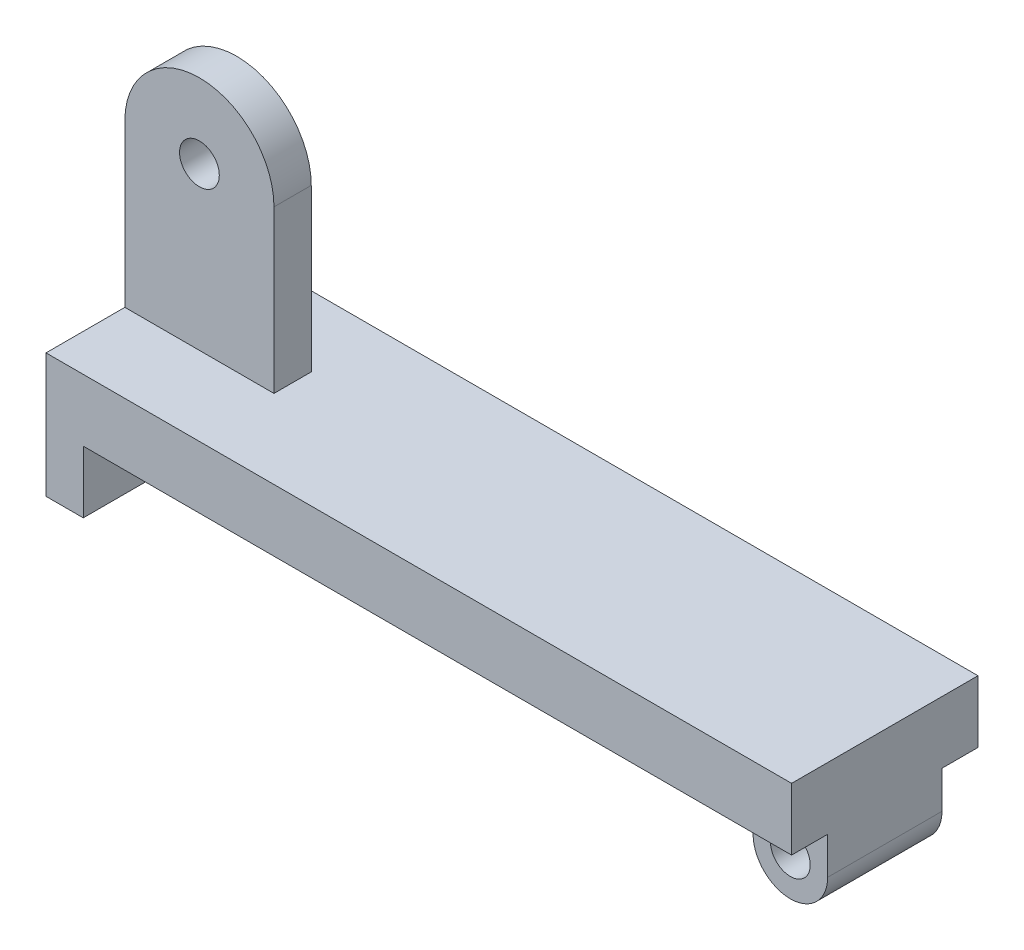
ISO-10303-21;
HEADER;
FILE_DESCRIPTION(('STEP AP214'),'2;1');
FILE_NAME('part.step','',(''),(''),'','','');
FILE_SCHEMA(('AUTOMOTIVE_DESIGN { 1 0 10303 214 1 1 1 1 }'));
ENDSEC;
DATA;
#1=APPLICATION_CONTEXT('core data for automotive mechanical design processes');
#2=APPLICATION_PROTOCOL_DEFINITION('international standard','automotive_design',2000,#1);
#3=PRODUCT_CONTEXT('',#1,'mechanical');
#4=PRODUCT('Part','Part','',(#3));
#5=PRODUCT_RELATED_PRODUCT_CATEGORY('part','',(#4));
#6=PRODUCT_DEFINITION_FORMATION('','',#4);
#7=PRODUCT_DEFINITION_CONTEXT('part definition',#1,'design');
#8=PRODUCT_DEFINITION('design','',#6,#7);
#9=PRODUCT_DEFINITION_SHAPE('','',#8);
#10=(LENGTH_UNIT() NAMED_UNIT(*) SI_UNIT(.MILLI.,.METRE.));
#11=(NAMED_UNIT(*) PLANE_ANGLE_UNIT() SI_UNIT($,.RADIAN.));
#12=(NAMED_UNIT(*) SI_UNIT($,.STERADIAN.) SOLID_ANGLE_UNIT());
#13=UNCERTAINTY_MEASURE_WITH_UNIT(LENGTH_MEASURE(1.E-05),#10,'distance_accuracy_value','');
#14=(GEOMETRIC_REPRESENTATION_CONTEXT(3) GLOBAL_UNCERTAINTY_ASSIGNED_CONTEXT((#13)) GLOBAL_UNIT_ASSIGNED_CONTEXT((#10,
#11,#12)) REPRESENTATION_CONTEXT('',''));
#15=CARTESIAN_POINT('',(0.,0.,0.));
#16=DIRECTION('',(0.,0.,1.));
#17=DIRECTION('',(1.,0.,0.));
#18=AXIS2_PLACEMENT_3D('',#15,#16,#17);
#19=CARTESIAN_POINT('',(22.37690411287,-6.,-1.00187064475671));
#20=DIRECTION('',(1.,0.,0.));
#21=DIRECTION('',(0.,0.,-1.));
#22=AXIS2_PLACEMENT_3D('',#19,#20,#21);
#23=PLANE('',#22);
#24=DIRECTION('',(0.,-1.,0.));
#25=VECTOR('',#24,1.);
#26=CARTESIAN_POINT('',(22.37690411287,0.,-1.40187064475671));
#27=LINE('',#26,#25);
#28=CARTESIAN_POINT('',(22.37690411287,0.,-1.40187064475671));
#29=VERTEX_POINT('',#28);
#30=CARTESIAN_POINT('',(22.37690411287,-3.,-1.40187064475671));
#31=VERTEX_POINT('',#30);
#32=EDGE_CURVE('E201',#29,#31,#27,.T.);
#33=ORIENTED_EDGE('',*,*,#32,.F.);
#34=DIRECTION('',(0.,0.,-1.));
#35=VECTOR('',#34,1.);
#36=CARTESIAN_POINT('',(22.37690411287,0.,-1.00187064475671));
#37=LINE('',#36,#35);
#38=CARTESIAN_POINT('',(22.37690411287,0.,-10.6018706447567));
#39=VERTEX_POINT('',#38);
#40=EDGE_CURVE('E206',#29,#39,#37,.T.);
#41=ORIENTED_EDGE('',*,*,#40,.T.);
#42=DIRECTION('',(0.,1.,0.));
#43=VECTOR('',#42,1.);
#44=CARTESIAN_POINT('',(22.37690411287,0.,-10.6018706447567));
#45=LINE('',#44,#43);
#46=CARTESIAN_POINT('',(22.37690411287,-3.,-10.6018706447567));
#47=VERTEX_POINT('',#46);
#48=EDGE_CURVE('E220',#47,#39,#45,.T.);
#49=ORIENTED_EDGE('',*,*,#48,.F.);
#50=DIRECTION('',(0.,0.,1.));
#51=VECTOR('',#50,1.);
#52=CARTESIAN_POINT('',(22.37690411287,-3.,-21.0018706447567));
#53=LINE('',#52,#51);
#54=EDGE_CURVE('E329',#47,#31,#53,.T.);
#55=ORIENTED_EDGE('',*,*,#54,.T.);
#56=EDGE_LOOP('',(#33,#41,#49,#55));
#57=FACE_BOUND('',#56,.T.);
#58=ADVANCED_FACE('F74',(#57),#23,.F.);
#59=CARTESIAN_POINT('',(25.37690411287,-3.,-21.0018706447567));
#60=DIRECTION('',(0.,0.,1.));
#61=DIRECTION('',(1.,0.,0.));
#62=AXIS2_PLACEMENT_3D('',#59,#60,#61);
#63=CYLINDRICAL_SURFACE('',#62,3.);
#64=DIRECTION('',(0.,0.,1.));
#65=VECTOR('',#64,1.);
#66=CARTESIAN_POINT('',(28.37690411287,-3.,-21.0018706447567));
#67=LINE('',#66,#65);
#68=CARTESIAN_POINT('',(28.37690411287,-3.,-10.6018706447567));
#69=VERTEX_POINT('',#68);
#70=CARTESIAN_POINT('',(28.37690411287,-3.,-1.40187064475671));
#71=VERTEX_POINT('',#70);
#72=EDGE_CURVE('E267',#69,#71,#67,.T.);
#73=ORIENTED_EDGE('',*,*,#72,.T.);
#74=CARTESIAN_POINT('',(25.37690411287,-3.,-1.40187064475671));
#75=DIRECTION('',(0.,0.,1.));
#76=DIRECTION('',(1.,0.,0.));
#77=AXIS2_PLACEMENT_3D('',#74,#75,#76);
#78=CIRCLE('',#77,3.);
#79=EDGE_CURVE('E199',#71,#31,#78,.F.);
#80=ORIENTED_EDGE('',*,*,#79,.T.);
#81=ORIENTED_EDGE('',*,*,#54,.F.);
#82=CARTESIAN_POINT('',(25.37690411287,-3.,-10.6018706447567));
#83=DIRECTION('',(0.,0.,-1.));
#84=DIRECTION('',(-1.,0.,0.));
#85=AXIS2_PLACEMENT_3D('',#82,#83,#84);
#86=CIRCLE('',#85,3.);
#87=EDGE_CURVE('E91',#47,#69,#86,.F.);
#88=ORIENTED_EDGE('',*,*,#87,.T.);
#89=EDGE_LOOP('',(#73,#80,#81,#88));
#90=FACE_BOUND('',#89,.T.);
#91=ADVANCED_FACE('F363',(#90),#63,.T.);
#92=CARTESIAN_POINT('',(25.37690411287,-2.84095934116673,-21.0018706447567));
#93=DIRECTION('',(0.,0.,1.));
#94=DIRECTION('',(1.,0.,0.));
#95=AXIS2_PLACEMENT_3D('',#92,#93,#94);
#96=CYLINDRICAL_SURFACE('',#95,1.6);
#97=CARTESIAN_POINT('',(25.37690411287,-2.84095934116673,-10.6018706447567));
#98=DIRECTION('',(0.,0.,-1.));
#99=DIRECTION('',(-1.,0.,0.));
#100=AXIS2_PLACEMENT_3D('',#97,#98,#99);
#101=CIRCLE('',#100,1.6);
#102=CARTESIAN_POINT('',(23.77690411287,-2.84095934116673,-10.6018706447567));
#103=VERTEX_POINT('',#102);
#104=EDGE_CURVE('E78',#103,#103,#101,.F.);
#105=ORIENTED_EDGE('',*,*,#104,.F.);
#106=EDGE_LOOP('',(#105));
#107=FACE_BOUND('',#106,.T.);
#108=CARTESIAN_POINT('',(25.37690411287,-2.84095934116673,-1.40187064475671));
#109=DIRECTION('',(0.,0.,1.));
#110=DIRECTION('',(1.,0.,0.));
#111=AXIS2_PLACEMENT_3D('',#108,#109,#110);
#112=CIRCLE('',#111,1.6);
#113=CARTESIAN_POINT('',(26.97690411287,-2.84095934116673,-1.40187064475671));
#114=VERTEX_POINT('',#113);
#115=EDGE_CURVE('E208',#114,#114,#112,.F.);
#116=ORIENTED_EDGE('',*,*,#115,.F.);
#117=EDGE_LOOP('',(#116));
#118=FACE_BOUND('',#117,.T.);
#119=ADVANCED_FACE('F359',(#107,#118),#96,.F.);
#120=CARTESIAN_POINT('',(-19.62309588713,24.,-8.24744093905209));
#121=DIRECTION('',(-1.,0.,0.));
#122=DIRECTION('',(0.,0.,1.));
#123=AXIS2_PLACEMENT_3D('',#120,#121,#122);
#124=PLANE('',#123);
#125=DIRECTION('',(0.,0.,-1.));
#126=VECTOR('',#125,1.);
#127=CARTESIAN_POINT('',(-19.62309588713,5.,-8.24744093905209));
#128=LINE('',#127,#126);
#129=CARTESIAN_POINT('',(-19.62309588713,5.,-4.8474409390521));
#130=VERTEX_POINT('',#129);
#131=CARTESIAN_POINT('',(-19.62309588713,5.,-7.84744093905209));
#132=VERTEX_POINT('',#131);
#133=EDGE_CURVE('E263',#130,#132,#128,.T.);
#134=ORIENTED_EDGE('',*,*,#133,.T.);
#135=DIRECTION('',(0.,-1.,0.));
#136=VECTOR('',#135,1.);
#137=CARTESIAN_POINT('',(-19.62309588713,5.,-7.84744093905209));
#138=LINE('',#137,#136);
#139=CARTESIAN_POINT('',(-19.62309588713,18.,-7.84744093905209));
#140=VERTEX_POINT('',#139);
#141=EDGE_CURVE('E230',#140,#132,#138,.T.);
#142=ORIENTED_EDGE('',*,*,#141,.F.);
#143=DIRECTION('',(0.,0.,1.));
#144=VECTOR('',#143,1.);
#145=CARTESIAN_POINT('',(-19.62309588713,18.,-23.4474409390521));
#146=LINE('',#145,#144);
#147=CARTESIAN_POINT('',(-19.62309588713,18.,-4.8474409390521));
#148=VERTEX_POINT('',#147);
#149=EDGE_CURVE('E257',#140,#148,#146,.T.);
#150=ORIENTED_EDGE('',*,*,#149,.T.);
#151=DIRECTION('',(0.,1.,0.));
#152=VECTOR('',#151,1.);
#153=CARTESIAN_POINT('',(-19.62309588713,5.,-4.8474409390521));
#154=LINE('',#153,#152);
#155=EDGE_CURVE('E249',#130,#148,#154,.T.);
#156=ORIENTED_EDGE('',*,*,#155,.F.);
#157=EDGE_LOOP('',(#134,#142,#150,#156));
#158=FACE_BOUND('',#157,.T.);
#159=ADVANCED_FACE('F362',(#158),#124,.F.);
#160=CARTESIAN_POINT('',(28.37690411287,5.,-13.5018706447567));
#161=DIRECTION('',(-1.,0.,0.));
#162=DIRECTION('',(0.,0.,1.));
#163=AXIS2_PLACEMENT_3D('',#160,#161,#162);
#164=PLANE('',#163);
#165=DIRECTION('',(0.,0.,-1.));
#166=VECTOR('',#165,1.);
#167=CARTESIAN_POINT('',(28.37690411287,0.,-13.5018706447567));
#168=LINE('',#167,#166);
#169=CARTESIAN_POINT('',(28.37690411287,0.,1.49812935524329));
#170=VERTEX_POINT('',#169);
#171=CARTESIAN_POINT('',(28.37690411287,0.,-1.40187064475671));
#172=VERTEX_POINT('',#171);
#173=EDGE_CURVE('E179',#170,#172,#168,.T.);
#174=ORIENTED_EDGE('',*,*,#173,.T.);
#175=DIRECTION('',(0.,1.,0.));
#176=VECTOR('',#175,1.);
#177=CARTESIAN_POINT('',(28.37690411287,0.,-1.40187064475671));
#178=LINE('',#177,#176);
#179=EDGE_CURVE('E183',#71,#172,#178,.T.);
#180=ORIENTED_EDGE('',*,*,#179,.F.);
#181=ORIENTED_EDGE('',*,*,#72,.F.);
#182=DIRECTION('',(0.,-1.,0.));
#183=VECTOR('',#182,1.);
#184=CARTESIAN_POINT('',(28.37690411287,0.,-10.6018706447567));
#185=LINE('',#184,#183);
#186=CARTESIAN_POINT('',(28.37690411287,0.,-10.6018706447567));
#187=VERTEX_POINT('',#186);
#188=EDGE_CURVE('E217',#187,#69,#185,.T.);
#189=ORIENTED_EDGE('',*,*,#188,.F.);
#190=CARTESIAN_POINT('',(28.37690411287,0.,-13.5018706447567));
#191=VERTEX_POINT('',#190);
#192=EDGE_CURVE('E191',#187,#191,#168,.T.);
#193=ORIENTED_EDGE('',*,*,#192,.T.);
#194=DIRECTION('',(0.,-1.,0.));
#195=VECTOR('',#194,1.);
#196=CARTESIAN_POINT('',(28.37690411287,5.,-13.5018706447567));
#197=LINE('',#196,#195);
#198=CARTESIAN_POINT('',(28.37690411287,5.,-13.5018706447567));
#199=VERTEX_POINT('',#198);
#200=EDGE_CURVE('E320',#199,#191,#197,.T.);
#201=ORIENTED_EDGE('',*,*,#200,.F.);
#202=DIRECTION('',(0.,0.,-1.));
#203=VECTOR('',#202,1.);
#204=CARTESIAN_POINT('',(28.37690411287,5.,-13.5018706447567));
#205=LINE('',#204,#203);
#206=CARTESIAN_POINT('',(28.37690411287,5.,1.49812935524329));
#207=VERTEX_POINT('',#206);
#208=EDGE_CURVE('E306',#207,#199,#205,.T.);
#209=ORIENTED_EDGE('',*,*,#208,.F.);
#210=DIRECTION('',(0.,-1.,0.));
#211=VECTOR('',#210,1.);
#212=CARTESIAN_POINT('',(28.37690411287,5.,1.49812935524329));
#213=LINE('',#212,#211);
#214=EDGE_CURVE('E186',#207,#170,#213,.T.);
#215=ORIENTED_EDGE('',*,*,#214,.T.);
#216=EDGE_LOOP('',(#174,#180,#181,#189,#193,#201,#209,#215));
#217=FACE_BOUND('',#216,.T.);
#218=ADVANCED_FACE('F181',(#217),#164,.F.);
#219=CARTESIAN_POINT('',(0.,0.,0.));
#220=DIRECTION('',(0.,1.,0.));
#221=DIRECTION('',(0.,0.,1.));
#222=AXIS2_PLACEMENT_3D('',#219,#220,#221);
#223=PLANE('',#222);
#224=ORIENTED_EDGE('',*,*,#40,.F.);
#225=DIRECTION('',(-1.,0.,0.));
#226=VECTOR('',#225,1.);
#227=CARTESIAN_POINT('',(22.37690411287,0.,-1.40187064475671));
#228=LINE('',#227,#226);
#229=EDGE_CURVE('E197',#172,#29,#228,.T.);
#230=ORIENTED_EDGE('',*,*,#229,.F.);
#231=ORIENTED_EDGE('',*,*,#173,.F.);
#232=DIRECTION('',(1.,0.,0.));
#233=VECTOR('',#232,1.);
#234=CARTESIAN_POINT('',(-31.62309588713,0.,1.49812935524329));
#235=LINE('',#234,#233);
#236=CARTESIAN_POINT('',(-28.62309588713,0.,1.49812935524329));
#237=VERTEX_POINT('',#236);
#238=EDGE_CURVE('E298',#237,#170,#235,.T.);
#239=ORIENTED_EDGE('',*,*,#238,.F.);
#240=DIRECTION('',(0.,0.,1.));
#241=VECTOR('',#240,1.);
#242=CARTESIAN_POINT('',(-28.62309588713,0.,1.49812935524329));
#243=LINE('',#242,#241);
#244=CARTESIAN_POINT('',(-28.62309588713,0.,-13.5018706447567));
#245=VERTEX_POINT('',#244);
#246=EDGE_CURVE('E272',#245,#237,#243,.T.);
#247=ORIENTED_EDGE('',*,*,#246,.F.);
#248=DIRECTION('',(-1.,0.,0.));
#249=VECTOR('',#248,1.);
#250=CARTESIAN_POINT('',(-31.62309588713,0.,-13.5018706447567));
#251=LINE('',#250,#249);
#252=EDGE_CURVE('E190',#191,#245,#251,.T.);
#253=ORIENTED_EDGE('',*,*,#252,.F.);
#254=ORIENTED_EDGE('',*,*,#192,.F.);
#255=DIRECTION('',(1.,0.,0.));
#256=VECTOR('',#255,1.);
#257=CARTESIAN_POINT('',(28.37690411287,0.,-10.6018706447567));
#258=LINE('',#257,#256);
#259=EDGE_CURVE('E224',#39,#187,#258,.T.);
#260=ORIENTED_EDGE('',*,*,#259,.F.);
#261=EDGE_LOOP('',(#224,#230,#231,#239,#247,#253,#254,#260));
#262=FACE_BOUND('',#261,.T.);
#263=ADVANCED_FACE('F204',(#262),#223,.F.);
#264=CARTESIAN_POINT('',(-31.62309588713,5.,-13.5018706447567));
#265=DIRECTION('',(1.,0.,0.));
#266=DIRECTION('',(0.,0.,-1.));
#267=AXIS2_PLACEMENT_3D('',#264,#265,#266);
#268=PLANE('',#267);
#269=DIRECTION('',(0.,1.,0.));
#270=VECTOR('',#269,1.);
#271=CARTESIAN_POINT('',(-31.62309588713,5.,-7.84744093905209));
#272=LINE('',#271,#270);
#273=CARTESIAN_POINT('',(-31.62309588713,5.,-7.84744093905209));
#274=VERTEX_POINT('',#273);
#275=CARTESIAN_POINT('',(-31.62309588713,18.,-7.84744093905209));
#276=VERTEX_POINT('',#275);
#277=EDGE_CURVE('E99',#274,#276,#272,.T.);
#278=ORIENTED_EDGE('',*,*,#277,.F.);
#279=DIRECTION('',(0.,0.,1.));
#280=VECTOR('',#279,1.);
#281=CARTESIAN_POINT('',(-31.62309588713,5.,-13.5018706447567));
#282=LINE('',#281,#280);
#283=CARTESIAN_POINT('',(-31.62309588713,5.,-13.5018706447567));
#284=VERTEX_POINT('',#283);
#285=EDGE_CURVE('E299',#284,#274,#282,.T.);
#286=ORIENTED_EDGE('',*,*,#285,.F.);
#287=DIRECTION('',(0.,-1.,0.));
#288=VECTOR('',#287,1.);
#289=CARTESIAN_POINT('',(-31.62309588713,5.,-13.5018706447567));
#290=LINE('',#289,#288);
#291=CARTESIAN_POINT('',(-31.62309588713,-5.,-13.5018706447567));
#292=VERTEX_POINT('',#291);
#293=EDGE_CURVE('E312',#284,#292,#290,.T.);
#294=ORIENTED_EDGE('',*,*,#293,.T.);
#295=DIRECTION('',(0.,0.,-1.));
#296=VECTOR('',#295,1.);
#297=CARTESIAN_POINT('',(-31.62309588713,-5.,1.49812935524329));
#298=LINE('',#297,#296);
#299=CARTESIAN_POINT('',(-31.62309588713,-5.,1.49812935524329));
#300=VERTEX_POINT('',#299);
#301=EDGE_CURVE('E273',#300,#292,#298,.T.);
#302=ORIENTED_EDGE('',*,*,#301,.F.);
#303=DIRECTION('',(0.,-1.,0.));
#304=VECTOR('',#303,1.);
#305=CARTESIAN_POINT('',(-31.62309588713,5.,1.49812935524329));
#306=LINE('',#305,#304);
#307=CARTESIAN_POINT('',(-31.62309588713,5.,1.49812935524329));
#308=VERTEX_POINT('',#307);
#309=EDGE_CURVE('E326',#308,#300,#306,.T.);
#310=ORIENTED_EDGE('',*,*,#309,.F.);
#311=CARTESIAN_POINT('',(-31.62309588713,5.,-4.8474409390521));
#312=VERTEX_POINT('',#311);
#313=EDGE_CURVE('E303',#312,#308,#282,.T.);
#314=ORIENTED_EDGE('',*,*,#313,.F.);
#315=DIRECTION('',(0.,-1.,0.));
#316=VECTOR('',#315,1.);
#317=CARTESIAN_POINT('',(-31.62309588713,5.,-4.8474409390521));
#318=LINE('',#317,#316);
#319=CARTESIAN_POINT('',(-31.62309588713,18.,-4.8474409390521));
#320=VERTEX_POINT('',#319);
#321=EDGE_CURVE('E242',#320,#312,#318,.T.);
#322=ORIENTED_EDGE('',*,*,#321,.F.);
#323=DIRECTION('',(0.,0.,1.));
#324=VECTOR('',#323,1.);
#325=CARTESIAN_POINT('',(-31.62309588713,18.,-23.4474409390521));
#326=LINE('',#325,#324);
#327=EDGE_CURVE('E260',#276,#320,#326,.T.);
#328=ORIENTED_EDGE('',*,*,#327,.F.);
#329=EDGE_LOOP('',(#278,#286,#294,#302,#310,#314,#322,#328));
#330=FACE_BOUND('',#329,.T.);
#331=ADVANCED_FACE('F76',(#330),#268,.F.);
#332=CARTESIAN_POINT('',(-31.62309588713,5.,1.49812935524329));
#333=DIRECTION('',(0.,0.,-1.));
#334=DIRECTION('',(-1.,0.,0.));
#335=AXIS2_PLACEMENT_3D('',#332,#333,#334);
#336=PLANE('',#335);
#337=ORIENTED_EDGE('',*,*,#309,.T.);
#338=DIRECTION('',(-1.,0.,0.));
#339=VECTOR('',#338,1.);
#340=CARTESIAN_POINT('',(-31.62309588713,-5.,1.49812935524329));
#341=LINE('',#340,#339);
#342=CARTESIAN_POINT('',(-28.62309588713,-5.,1.49812935524329));
#343=VERTEX_POINT('',#342);
#344=EDGE_CURVE('E283',#343,#300,#341,.T.);
#345=ORIENTED_EDGE('',*,*,#344,.F.);
#346=DIRECTION('',(0.,1.,0.));
#347=VECTOR('',#346,1.);
#348=CARTESIAN_POINT('',(-28.62309588713,-5.,1.49812935524329));
#349=LINE('',#348,#347);
#350=EDGE_CURVE('E287',#343,#237,#349,.T.);
#351=ORIENTED_EDGE('',*,*,#350,.T.);
#352=ORIENTED_EDGE('',*,*,#238,.T.);
#353=ORIENTED_EDGE('',*,*,#214,.F.);
#354=DIRECTION('',(1.,0.,0.));
#355=VECTOR('',#354,1.);
#356=CARTESIAN_POINT('',(-31.62309588713,5.,1.49812935524329));
#357=LINE('',#356,#355);
#358=EDGE_CURVE('E302',#308,#207,#357,.T.);
#359=ORIENTED_EDGE('',*,*,#358,.F.);
#360=EDGE_LOOP('',(#337,#345,#351,#352,#353,#359));
#361=FACE_BOUND('',#360,.T.);
#362=ADVANCED_FACE('F400',(#361),#336,.F.);
#363=CARTESIAN_POINT('',(-31.62309588713,5.,-13.5018706447567));
#364=DIRECTION('',(0.,0.,1.));
#365=DIRECTION('',(1.,0.,0.));
#366=AXIS2_PLACEMENT_3D('',#363,#364,#365);
#367=PLANE('',#366);
#368=ORIENTED_EDGE('',*,*,#252,.T.);
#369=DIRECTION('',(0.,1.,0.));
#370=VECTOR('',#369,1.);
#371=CARTESIAN_POINT('',(-28.62309588713,-5.,-13.5018706447567));
#372=LINE('',#371,#370);
#373=CARTESIAN_POINT('',(-28.62309588713,-5.,-13.5018706447567));
#374=VERTEX_POINT('',#373);
#375=EDGE_CURVE('E294',#374,#245,#372,.T.);
#376=ORIENTED_EDGE('',*,*,#375,.F.);
#377=DIRECTION('',(1.,0.,0.));
#378=VECTOR('',#377,1.);
#379=CARTESIAN_POINT('',(-31.62309588713,-5.,-13.5018706447567));
#380=LINE('',#379,#378);
#381=EDGE_CURVE('E277',#292,#374,#380,.T.);
#382=ORIENTED_EDGE('',*,*,#381,.F.);
#383=ORIENTED_EDGE('',*,*,#293,.F.);
#384=DIRECTION('',(-1.,0.,0.));
#385=VECTOR('',#384,1.);
#386=CARTESIAN_POINT('',(-31.62309588713,5.,-13.5018706447567));
#387=LINE('',#386,#385);
#388=EDGE_CURVE('E309',#199,#284,#387,.T.);
#389=ORIENTED_EDGE('',*,*,#388,.F.);
#390=ORIENTED_EDGE('',*,*,#200,.T.);
#391=EDGE_LOOP('',(#368,#376,#382,#383,#389,#390));
#392=FACE_BOUND('',#391,.T.);
#393=ADVANCED_FACE('F395',(#392),#367,.F.);
#394=CARTESIAN_POINT('',(0.,5.,0.));
#395=DIRECTION('',(0.,1.,0.));
#396=DIRECTION('',(0.,0.,1.));
#397=AXIS2_PLACEMENT_3D('',#394,#395,#396);
#398=PLANE('',#397);
#399=ORIENTED_EDGE('',*,*,#133,.F.);
#400=DIRECTION('',(1.,0.,0.));
#401=VECTOR('',#400,1.);
#402=CARTESIAN_POINT('',(-31.62309588713,5.,-4.8474409390521));
#403=LINE('',#402,#401);
#404=EDGE_CURVE('E246',#312,#130,#403,.T.);
#405=ORIENTED_EDGE('',*,*,#404,.F.);
#406=ORIENTED_EDGE('',*,*,#313,.T.);
#407=ORIENTED_EDGE('',*,*,#358,.T.);
#408=ORIENTED_EDGE('',*,*,#208,.T.);
#409=ORIENTED_EDGE('',*,*,#388,.T.);
#410=ORIENTED_EDGE('',*,*,#285,.T.);
#411=DIRECTION('',(-1.,0.,0.));
#412=VECTOR('',#411,1.);
#413=CARTESIAN_POINT('',(-19.62309588713,5.,-7.84744093905209));
#414=LINE('',#413,#412);
#415=EDGE_CURVE('E233',#132,#274,#414,.T.);
#416=ORIENTED_EDGE('',*,*,#415,.F.);
#417=EDGE_LOOP('',(#399,#405,#406,#407,#408,#409,#410,#416));
#418=FACE_BOUND('',#417,.T.);
#419=ADVANCED_FACE('F391',(#418),#398,.T.);
#420=CARTESIAN_POINT('',(-28.62309588713,-5.,1.49812935524329));
#421=DIRECTION('',(-1.,0.,0.));
#422=DIRECTION('',(0.,0.,1.));
#423=AXIS2_PLACEMENT_3D('',#420,#421,#422);
#424=PLANE('',#423);
#425=ORIENTED_EDGE('',*,*,#246,.T.);
#426=ORIENTED_EDGE('',*,*,#350,.F.);
#427=DIRECTION('',(0.,0.,1.));
#428=VECTOR('',#427,1.);
#429=CARTESIAN_POINT('',(-28.62309588713,-5.,1.49812935524329));
#430=LINE('',#429,#428);
#431=EDGE_CURVE('E280',#374,#343,#430,.T.);
#432=ORIENTED_EDGE('',*,*,#431,.F.);
#433=ORIENTED_EDGE('',*,*,#375,.T.);
#434=EDGE_LOOP('',(#425,#426,#432,#433));
#435=FACE_BOUND('',#434,.T.);
#436=ADVANCED_FACE('F387',(#435),#424,.F.);
#437=CARTESIAN_POINT('',(0.,-5.,0.));
#438=DIRECTION('',(0.,-1.,0.));
#439=DIRECTION('',(0.,0.,-1.));
#440=AXIS2_PLACEMENT_3D('',#437,#438,#439);
#441=PLANE('',#440);
#442=ORIENTED_EDGE('',*,*,#301,.T.);
#443=ORIENTED_EDGE('',*,*,#381,.T.);
#444=ORIENTED_EDGE('',*,*,#431,.T.);
#445=ORIENTED_EDGE('',*,*,#344,.T.);
#446=EDGE_LOOP('',(#442,#443,#444,#445));
#447=FACE_BOUND('',#446,.T.);
#448=ADVANCED_FACE('F383',(#447),#441,.T.);
#449=CARTESIAN_POINT('',(-25.62309588713,18.,-23.4474409390521));
#450=DIRECTION('',(0.,0.,1.));
#451=DIRECTION('',(1.,0.,0.));
#452=AXIS2_PLACEMENT_3D('',#449,#450,#451);
#453=CYLINDRICAL_SURFACE('',#452,1.6);
#454=CARTESIAN_POINT('',(-25.62309588713,18.,-7.84744093905209));
#455=DIRECTION('',(0.,0.,1.));
#456=DIRECTION('',(1.,0.,0.));
#457=AXIS2_PLACEMENT_3D('',#454,#455,#456);
#458=CIRCLE('',#457,1.6);
#459=CARTESIAN_POINT('',(-24.02309588713,18.,-7.84744093905209));
#460=VERTEX_POINT('',#459);
#461=EDGE_CURVE('E238',#460,#460,#458,.F.);
#462=ORIENTED_EDGE('',*,*,#461,.T.);
#463=EDGE_LOOP('',(#462));
#464=FACE_BOUND('',#463,.T.);
#465=CARTESIAN_POINT('',(-25.62309588713,18.,-4.8474409390521));
#466=DIRECTION('',(0.,0.,-1.));
#467=DIRECTION('',(-1.,0.,0.));
#468=AXIS2_PLACEMENT_3D('',#465,#466,#467);
#469=CIRCLE('',#468,1.6);
#470=CARTESIAN_POINT('',(-27.22309588713,18.,-4.8474409390521));
#471=VERTEX_POINT('',#470);
#472=EDGE_CURVE('E253',#471,#471,#469,.F.);
#473=ORIENTED_EDGE('',*,*,#472,.T.);
#474=EDGE_LOOP('',(#473));
#475=FACE_BOUND('',#474,.T.);
#476=ADVANCED_FACE('F386',(#464,#475),#453,.F.);
#477=CARTESIAN_POINT('',(-25.62309588713,18.,-23.4474409390521));
#478=DIRECTION('',(0.,0.,1.));
#479=DIRECTION('',(1.,0.,0.));
#480=AXIS2_PLACEMENT_3D('',#477,#478,#479);
#481=CYLINDRICAL_SURFACE('',#480,6.);
#482=ORIENTED_EDGE('',*,*,#149,.F.);
#483=CARTESIAN_POINT('',(-25.62309588713,18.,-7.84744093905209));
#484=DIRECTION('',(0.,0.,1.));
#485=DIRECTION('',(1.,0.,0.));
#486=AXIS2_PLACEMENT_3D('',#483,#484,#485);
#487=CIRCLE('',#486,6.);
#488=EDGE_CURVE('E12',#140,#276,#487,.T.);
#489=ORIENTED_EDGE('',*,*,#488,.T.);
#490=ORIENTED_EDGE('',*,*,#327,.T.);
#491=CARTESIAN_POINT('',(-25.62309588713,18.,-4.8474409390521));
#492=DIRECTION('',(0.,0.,-1.));
#493=DIRECTION('',(-1.,0.,0.));
#494=AXIS2_PLACEMENT_3D('',#491,#492,#493);
#495=CIRCLE('',#494,6.);
#496=EDGE_CURVE('E84',#320,#148,#495,.T.);
#497=ORIENTED_EDGE('',*,*,#496,.T.);
#498=EDGE_LOOP('',(#482,#489,#490,#497));
#499=FACE_BOUND('',#498,.T.);
#500=ADVANCED_FACE('F338',(#499),#481,.T.);
#501=CARTESIAN_POINT('',(0.,0.,-4.8474409390521));
#502=DIRECTION('',(0.,0.,-1.));
#503=DIRECTION('',(-1.,0.,0.));
#504=AXIS2_PLACEMENT_3D('',#501,#502,#503);
#505=PLANE('',#504);
#506=ORIENTED_EDGE('',*,*,#321,.T.);
#507=ORIENTED_EDGE('',*,*,#404,.T.);
#508=ORIENTED_EDGE('',*,*,#155,.T.);
#509=ORIENTED_EDGE('',*,*,#496,.F.);
#510=EDGE_LOOP('',(#506,#507,#508,#509));
#511=FACE_BOUND('',#510,.T.);
#512=ORIENTED_EDGE('',*,*,#472,.F.);
#513=EDGE_LOOP('',(#512));
#514=FACE_BOUND('',#513,.T.);
#515=ADVANCED_FACE('F342',(#511,#514),#505,.F.);
#516=CARTESIAN_POINT('',(0.,0.,-7.8474409390521));
#517=DIRECTION('',(0.,0.,1.));
#518=DIRECTION('',(1.,0.,0.));
#519=AXIS2_PLACEMENT_3D('',#516,#517,#518);
#520=PLANE('',#519);
#521=ORIENTED_EDGE('',*,*,#141,.T.);
#522=ORIENTED_EDGE('',*,*,#415,.T.);
#523=ORIENTED_EDGE('',*,*,#277,.T.);
#524=ORIENTED_EDGE('',*,*,#488,.F.);
#525=EDGE_LOOP('',(#521,#522,#523,#524));
#526=FACE_BOUND('',#525,.T.);
#527=ORIENTED_EDGE('',*,*,#461,.F.);
#528=EDGE_LOOP('',(#527));
#529=FACE_BOUND('',#528,.T.);
#530=ADVANCED_FACE('F371',(#526,#529),#520,.F.);
#531=CARTESIAN_POINT('',(0.,0.,-10.6018706447567));
#532=DIRECTION('',(0.,0.,-1.));
#533=DIRECTION('',(-1.,0.,0.));
#534=AXIS2_PLACEMENT_3D('',#531,#532,#533);
#535=PLANE('',#534);
#536=ORIENTED_EDGE('',*,*,#48,.T.);
#537=ORIENTED_EDGE('',*,*,#259,.T.);
#538=ORIENTED_EDGE('',*,*,#188,.T.);
#539=ORIENTED_EDGE('',*,*,#87,.F.);
#540=EDGE_LOOP('',(#536,#537,#538,#539));
#541=FACE_BOUND('',#540,.T.);
#542=ORIENTED_EDGE('',*,*,#104,.T.);
#543=EDGE_LOOP('',(#542));
#544=FACE_BOUND('',#543,.T.);
#545=ADVANCED_FACE('F357',(#541,#544),#535,.T.);
#546=CARTESIAN_POINT('',(0.,0.,-1.40187064475671));
#547=DIRECTION('',(0.,0.,1.));
#548=DIRECTION('',(1.,0.,0.));
#549=AXIS2_PLACEMENT_3D('',#546,#547,#548);
#550=PLANE('',#549);
#551=ORIENTED_EDGE('',*,*,#179,.T.);
#552=ORIENTED_EDGE('',*,*,#229,.T.);
#553=ORIENTED_EDGE('',*,*,#32,.T.);
#554=ORIENTED_EDGE('',*,*,#79,.F.);
#555=EDGE_LOOP('',(#551,#552,#553,#554));
#556=FACE_BOUND('',#555,.T.);
#557=ORIENTED_EDGE('',*,*,#115,.T.);
#558=EDGE_LOOP('',(#557));
#559=FACE_BOUND('',#558,.T.);
#560=ADVANCED_FACE('F194',(#556,#559),#550,.T.);
#561=CLOSED_SHELL('',(#58,#91,#119,#159,#218,#263,#331,#362,#393,#419,#436,#448,#476,#500,#515,
#530,#545,#560));
#562=MANIFOLD_SOLID_BREP('B2',#561);
#563=ADVANCED_BREP_SHAPE_REPRESENTATION('',(#18,#562),#14);
#564=SHAPE_DEFINITION_REPRESENTATION(#9,#563);
ENDSEC;
END-ISO-10303-21;
